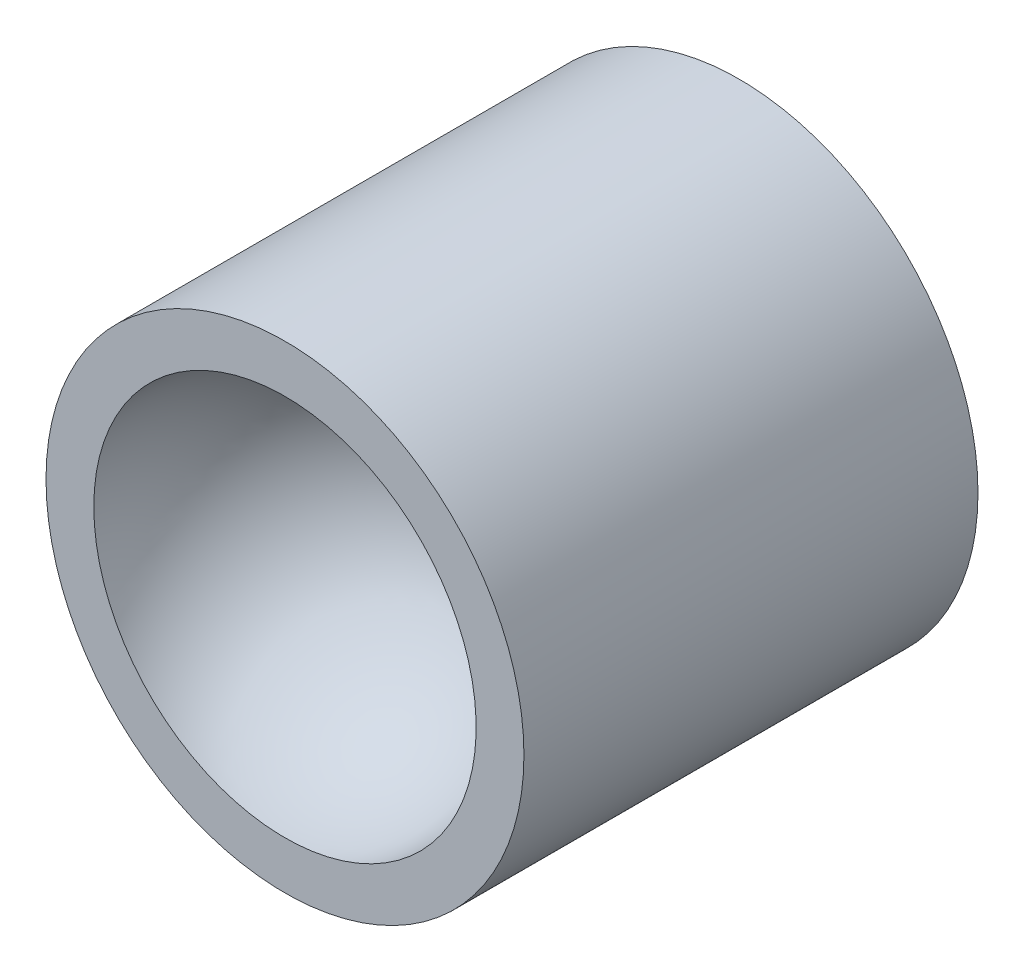
ISO-10303-21;
HEADER;
FILE_DESCRIPTION(('STEP AP214'),'2;1');
FILE_NAME('part.step','',(''),(''),'','','');
FILE_SCHEMA(('AUTOMOTIVE_DESIGN { 1 0 10303 214 1 1 1 1 }'));
ENDSEC;
DATA;
#1=APPLICATION_CONTEXT('core data for automotive mechanical design processes');
#2=APPLICATION_PROTOCOL_DEFINITION('international standard','automotive_design',2000,#1);
#3=PRODUCT_CONTEXT('',#1,'mechanical');
#4=PRODUCT('Part','Part','',(#3));
#5=PRODUCT_RELATED_PRODUCT_CATEGORY('part','',(#4));
#6=PRODUCT_DEFINITION_FORMATION('','',#4);
#7=PRODUCT_DEFINITION_CONTEXT('part definition',#1,'design');
#8=PRODUCT_DEFINITION('design','',#6,#7);
#9=PRODUCT_DEFINITION_SHAPE('','',#8);
#10=(LENGTH_UNIT() NAMED_UNIT(*) SI_UNIT(.MILLI.,.METRE.));
#11=(NAMED_UNIT(*) PLANE_ANGLE_UNIT() SI_UNIT($,.RADIAN.));
#12=(NAMED_UNIT(*) SI_UNIT($,.STERADIAN.) SOLID_ANGLE_UNIT());
#13=UNCERTAINTY_MEASURE_WITH_UNIT(LENGTH_MEASURE(1.E-05),#10,'distance_accuracy_value','');
#14=(GEOMETRIC_REPRESENTATION_CONTEXT(3) GLOBAL_UNCERTAINTY_ASSIGNED_CONTEXT((#13)) GLOBAL_UNIT_ASSIGNED_CONTEXT((#10,
#11,#12)) REPRESENTATION_CONTEXT('',''));
#15=CARTESIAN_POINT('',(0.,0.,0.));
#16=DIRECTION('',(0.,0.,1.));
#17=DIRECTION('',(1.,0.,0.));
#18=AXIS2_PLACEMENT_3D('',#15,#16,#17);
#19=CARTESIAN_POINT('',(0.,0.,0.));
#20=DIRECTION('',(0.,0.,-1.));
#21=DIRECTION('',(-1.,0.,0.));
#22=AXIS2_PLACEMENT_3D('',#19,#20,#21);
#23=SPHERICAL_SURFACE('',#22,8.);
#24=CARTESIAN_POINT('',(0.,0.,0.));
#25=DIRECTION('',(0.,0.,-1.));
#26=DIRECTION('',(-1.,0.,0.));
#27=AXIS2_PLACEMENT_3D('',#24,#25,#26);
#28=CIRCLE('',#27,8.);
#29=CARTESIAN_POINT('',(-8.,0.,0.));
#30=VERTEX_POINT('',#29);
#31=EDGE_CURVE('E42',#30,#30,#28,.T.);
#32=ORIENTED_EDGE('',*,*,#31,.F.);
#33=EDGE_LOOP('',(#32));
#34=FACE_BOUND('',#33,.T.);
#35=ADVANCED_FACE('F32',(#34),#23,.F.);
#36=CARTESIAN_POINT('',(-10.,0.,-19.));
#37=DIRECTION('',(0.,0.,-1.));
#38=DIRECTION('',(-1.,0.,0.));
#39=AXIS2_PLACEMENT_3D('',#36,#37,#38);
#40=PLANE('',#39);
#41=CARTESIAN_POINT('',(0.,0.,-19.));
#42=DIRECTION('',(0.,0.,-1.));
#43=DIRECTION('',(-1.,0.,0.));
#44=AXIS2_PLACEMENT_3D('',#41,#42,#43);
#45=CIRCLE('',#44,1.5);
#46=CARTESIAN_POINT('',(-1.5,0.,-19.));
#47=VERTEX_POINT('',#46);
#48=EDGE_CURVE('E49',#47,#47,#45,.T.);
#49=ORIENTED_EDGE('',*,*,#48,.F.);
#50=EDGE_LOOP('',(#49));
#51=FACE_BOUND('',#50,.T.);
#52=CARTESIAN_POINT('',(0.,0.,-19.));
#53=DIRECTION('',(0.,0.,-1.));
#54=DIRECTION('',(-1.,0.,0.));
#55=AXIS2_PLACEMENT_3D('',#52,#53,#54);
#56=CIRCLE('',#55,10.);
#57=CARTESIAN_POINT('',(-10.,0.,-19.));
#58=VERTEX_POINT('',#57);
#59=EDGE_CURVE('E10',#58,#58,#56,.T.);
#60=ORIENTED_EDGE('',*,*,#59,.T.);
#61=EDGE_LOOP('',(#60));
#62=FACE_BOUND('',#61,.T.);
#63=ADVANCED_FACE('F64',(#51,#62),#40,.T.);
#64=CARTESIAN_POINT('',(0.,0.,-19.));
#65=DIRECTION('',(0.,0.,-1.));
#66=DIRECTION('',(-1.,0.,0.));
#67=AXIS2_PLACEMENT_3D('',#64,#65,#66);
#68=CYLINDRICAL_SURFACE('',#67,10.);
#69=CARTESIAN_POINT('',(0.,0.,0.));
#70=DIRECTION('',(0.,0.,-1.));
#71=DIRECTION('',(-1.,0.,0.));
#72=AXIS2_PLACEMENT_3D('',#69,#70,#71);
#73=CIRCLE('',#72,10.);
#74=CARTESIAN_POINT('',(-10.,0.,0.));
#75=VERTEX_POINT('',#74);
#76=EDGE_CURVE('E38',#75,#75,#73,.T.);
#77=ORIENTED_EDGE('',*,*,#76,.T.);
#78=EDGE_LOOP('',(#77));
#79=FACE_BOUND('',#78,.T.);
#80=ORIENTED_EDGE('',*,*,#59,.F.);
#81=EDGE_LOOP('',(#80));
#82=FACE_BOUND('',#81,.T.);
#83=ADVANCED_FACE('F66',(#79,#82),#68,.T.);
#84=CARTESIAN_POINT('',(-8.,0.,0.));
#85=DIRECTION('',(0.,0.,1.));
#86=DIRECTION('',(1.,0.,0.));
#87=AXIS2_PLACEMENT_3D('',#84,#85,#86);
#88=PLANE('',#87);
#89=ORIENTED_EDGE('',*,*,#31,.T.);
#90=EDGE_LOOP('',(#89));
#91=FACE_BOUND('',#90,.T.);
#92=ORIENTED_EDGE('',*,*,#76,.F.);
#93=EDGE_LOOP('',(#92));
#94=FACE_BOUND('',#93,.T.);
#95=ADVANCED_FACE('F60',(#91,#94),#88,.T.);
#96=CARTESIAN_POINT('',(0.,0.,-11.));
#97=DIRECTION('',(0.,0.,-1.));
#98=DIRECTION('',(-1.,0.,0.));
#99=AXIS2_PLACEMENT_3D('',#96,#97,#98);
#100=CYLINDRICAL_SURFACE('',#99,1.5);
#101=CARTESIAN_POINT('',(0.,0.,-11.));
#102=DIRECTION('',(0.,0.,-1.));
#103=DIRECTION('',(-1.,0.,0.));
#104=AXIS2_PLACEMENT_3D('',#101,#102,#103);
#105=CIRCLE('',#104,1.5);
#106=CARTESIAN_POINT('',(-1.5,0.,-11.));
#107=VERTEX_POINT('',#106);
#108=EDGE_CURVE('E46',#107,#107,#105,.T.);
#109=ORIENTED_EDGE('',*,*,#108,.F.);
#110=EDGE_LOOP('',(#109));
#111=FACE_BOUND('',#110,.T.);
#112=ORIENTED_EDGE('',*,*,#48,.T.);
#113=EDGE_LOOP('',(#112));
#114=FACE_BOUND('',#113,.T.);
#115=ADVANCED_FACE('F57',(#111,#114),#100,.F.);
#116=CARTESIAN_POINT('',(0.,0.,-11.));
#117=DIRECTION('',(0.,0.,-1.));
#118=DIRECTION('',(-1.,0.,0.));
#119=AXIS2_PLACEMENT_3D('',#116,#117,#118);
#120=PLANE('',#119);
#121=ORIENTED_EDGE('',*,*,#108,.T.);
#122=EDGE_LOOP('',(#121));
#123=FACE_BOUND('',#122,.T.);
#124=ADVANCED_FACE('F55',(#123),#120,.T.);
#125=CLOSED_SHELL('',(#35,#63,#83,#95,#115,#124));
#126=MANIFOLD_SOLID_BREP('B2',#125);
#127=ADVANCED_BREP_SHAPE_REPRESENTATION('',(#18,#126),#14);
#128=SHAPE_DEFINITION_REPRESENTATION(#9,#127);
ENDSEC;
END-ISO-10303-21;
